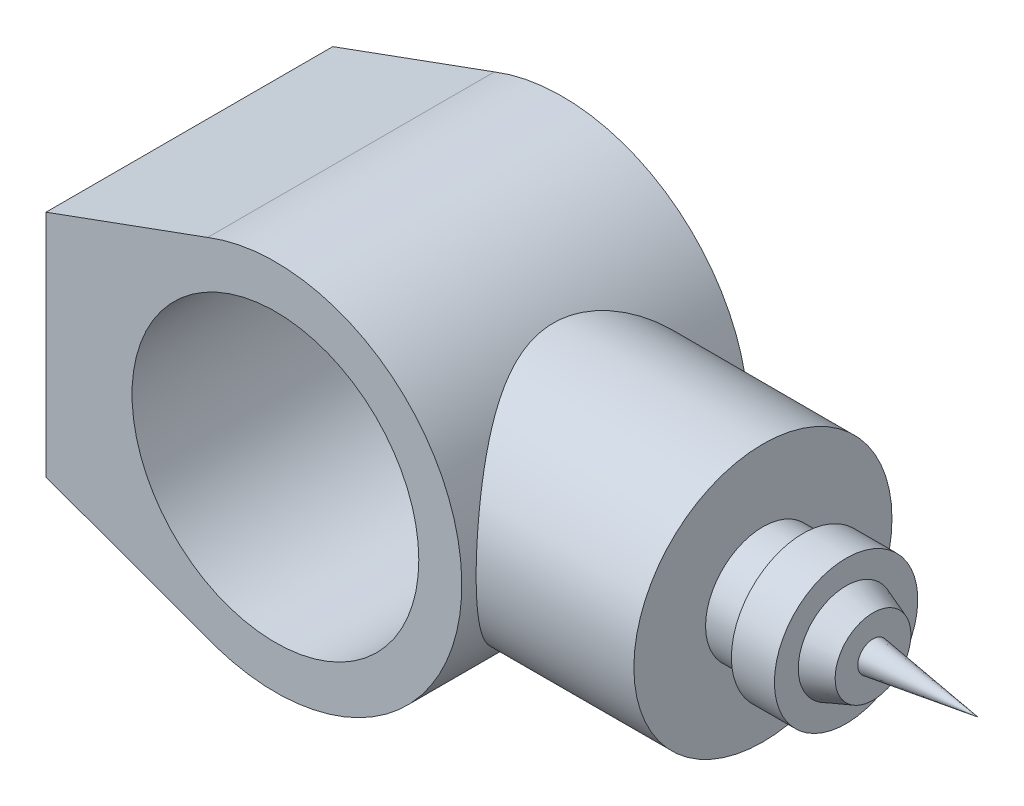
ISO-10303-21;
HEADER;
FILE_DESCRIPTION(('STEP AP214'),'2;1');
FILE_NAME('part.step','',(''),(''),'','','');
FILE_SCHEMA(('AUTOMOTIVE_DESIGN { 1 0 10303 214 1 1 1 1 }'));
ENDSEC;
DATA;
#1=APPLICATION_CONTEXT('core data for automotive mechanical design processes');
#2=APPLICATION_PROTOCOL_DEFINITION('international standard','automotive_design',2000,#1);
#3=PRODUCT_CONTEXT('',#1,'mechanical');
#4=PRODUCT('Part','Part','',(#3));
#5=PRODUCT_RELATED_PRODUCT_CATEGORY('part','',(#4));
#6=PRODUCT_DEFINITION_FORMATION('','',#4);
#7=PRODUCT_DEFINITION_CONTEXT('part definition',#1,'design');
#8=PRODUCT_DEFINITION('design','',#6,#7);
#9=PRODUCT_DEFINITION_SHAPE('','',#8);
#10=(LENGTH_UNIT() NAMED_UNIT(*) SI_UNIT(.MILLI.,.METRE.));
#11=(NAMED_UNIT(*) PLANE_ANGLE_UNIT() SI_UNIT($,.RADIAN.));
#12=(NAMED_UNIT(*) SI_UNIT($,.STERADIAN.) SOLID_ANGLE_UNIT());
#13=UNCERTAINTY_MEASURE_WITH_UNIT(LENGTH_MEASURE(1.E-05),#10,'distance_accuracy_value','');
#14=(GEOMETRIC_REPRESENTATION_CONTEXT(3) GLOBAL_UNCERTAINTY_ASSIGNED_CONTEXT((#13)) GLOBAL_UNIT_ASSIGNED_CONTEXT((#10,
#11,#12)) REPRESENTATION_CONTEXT('',''));
#15=CARTESIAN_POINT('',(0.,0.,0.));
#16=DIRECTION('',(0.,0.,1.));
#17=DIRECTION('',(1.,0.,0.));
#18=AXIS2_PLACEMENT_3D('',#15,#16,#17);
#19=CARTESIAN_POINT('',(0.,0.,50.));
#20=DIRECTION('',(0.,0.,-1.));
#21=DIRECTION('',(-1.,0.,0.));
#22=AXIS2_PLACEMENT_3D('',#19,#20,#21);
#23=CYLINDRICAL_SURFACE('',#22,65.);
#24=CARTESIAN_POINT('',(0.,0.,-50.));
#25=DIRECTION('',(0.,0.,1.));
#26=DIRECTION('',(1.,0.,0.));
#27=AXIS2_PLACEMENT_3D('',#24,#25,#26);
#28=CIRCLE('',#27,65.);
#29=CARTESIAN_POINT('',(-20.4555318195324,-61.6974166232274,-50.));
#30=VERTEX_POINT('',#29);
#31=CARTESIAN_POINT('',(-23.6316122739653,60.5520181441789,-50.));
#32=VERTEX_POINT('',#31);
#33=EDGE_CURVE('E138',#30,#32,#28,.T.);
#34=ORIENTED_EDGE('',*,*,#33,.T.);
#35=DIRECTION('',(0.,0.,-1.));
#36=VECTOR('',#35,1.);
#37=CARTESIAN_POINT('',(-23.6316122739653,60.5520181441789,50.));
#38=LINE('',#37,#36);
#39=CARTESIAN_POINT('',(-23.6316122739653,60.5520181441789,50.));
#40=VERTEX_POINT('',#39);
#41=EDGE_CURVE('E58',#40,#32,#38,.T.);
#42=ORIENTED_EDGE('',*,*,#41,.F.);
#43=CARTESIAN_POINT('',(0.,0.,50.));
#44=DIRECTION('',(0.,0.,1.));
#45=DIRECTION('',(1.,0.,0.));
#46=AXIS2_PLACEMENT_3D('',#43,#44,#45);
#47=CIRCLE('',#46,65.);
#48=CARTESIAN_POINT('',(-20.4555318195324,-61.6974166232274,50.));
#49=VERTEX_POINT('',#48);
#50=EDGE_CURVE('E141',#49,#40,#47,.T.);
#51=ORIENTED_EDGE('',*,*,#50,.F.);
#52=DIRECTION('',(0.,0.,-1.));
#53=VECTOR('',#52,1.);
#54=CARTESIAN_POINT('',(-20.4555318195324,-61.6974166232274,50.));
#55=LINE('',#54,#53);
#56=EDGE_CURVE('E147',#49,#30,#55,.T.);
#57=ORIENTED_EDGE('',*,*,#56,.T.);
#58=EDGE_LOOP('',(#34,#42,#51,#57));
#59=FACE_BOUND('',#58,.T.);
#60=CARTESIAN_POINT('',(65.,0.,-44.9999999999996));
#61=CARTESIAN_POINT('',(65.0000011696057,1.12147330120565,-45.0000012025278));
#62=CARTESIAN_POINT('',(64.9709159765212,2.24292945230778,-44.9580201602478));
#63=CARTESIAN_POINT('',(64.8553068641383,4.47658414079083,-44.7907856093685));
#64=CARTESIAN_POINT('',(64.7687842573088,5.58878288911932,-44.6655340035367));
#65=CARTESIAN_POINT('',(64.5403785763001,7.79555151848629,-44.3336771879687));
#66=CARTESIAN_POINT('',(64.3984760503456,8.89011506447753,-44.1270433931234));
#67=CARTESIAN_POINT('',(64.0626457436966,11.0533096019768,-43.635476013403));
#68=CARTESIAN_POINT('',(63.8687169569864,12.1219400915896,-43.3505409144371));
#69=CARTESIAN_POINT('',(63.4342222744662,14.2212125160506,-42.7078017297041));
#70=CARTESIAN_POINT('',(63.1938918545645,15.2520162370063,-42.3503651251473));
#71=CARTESIAN_POINT('',(62.6709259446924,17.2756280115287,-41.5659763086888));
#72=CARTESIAN_POINT('',(62.3882907364915,18.268436318107,-41.1390245597884));
#73=CARTESIAN_POINT('',(61.786108553932,20.2116697228796,-40.2199419970833));
#74=CARTESIAN_POINT('',(61.4665619062631,21.1620951960855,-39.7278117601439));
#75=CARTESIAN_POINT('',(60.7962171584065,23.0172309124315,-38.6825647509795));
#76=CARTESIAN_POINT('',(60.4454175300334,23.9219389167186,-38.1294449962191));
#77=CARTESIAN_POINT('',(59.6865648974474,25.7601880140228,-36.915173761793));
#78=CARTESIAN_POINT('',(59.2761881540199,26.6893215363404,-36.2488040005486));
#79=CARTESIAN_POINT('',(58.4330275057249,28.4880338622967,-34.852950205922));
#80=CARTESIAN_POINT('',(58.0002425478181,29.357609862654,-34.1234632053604));
#81=CARTESIAN_POINT('',(57.1195111836477,31.0364486388513,-32.6040251352399));
#82=CARTESIAN_POINT('',(56.6715447181891,31.8456267033452,-31.8139921794118));
#83=CARTESIAN_POINT('',(55.7691986061138,33.4006700551815,-30.1773036556988));
#84=CARTESIAN_POINT('',(55.3148185876118,34.146531653429,-29.3306447936716));
#85=CARTESIAN_POINT('',(54.3303114345594,35.6959084068904,-27.4326466159463));
#86=CARTESIAN_POINT('',(53.8005937511269,36.4872853280242,-26.3711450656522));
#87=CARTESIAN_POINT('',(52.7593327891933,37.9773509509911,-24.1760402563895));
#88=CARTESIAN_POINT('',(52.2477941160226,38.6760162868262,-23.0424189272513));
#89=CARTESIAN_POINT('',(51.2608149265043,39.9749077721744,-20.7072341856924));
#90=CARTESIAN_POINT('',(50.7853275075272,40.5752630453964,-19.5057627267962));
#91=CARTESIAN_POINT('',(49.8892399163793,41.6721166930026,-17.0369318640636));
#92=CARTESIAN_POINT('',(49.4686114171658,42.1686687478854,-15.7696069409939));
#93=CARTESIAN_POINT('',(48.8208029416878,42.9149535309565,-13.5723996352812));
#94=CARTESIAN_POINT('',(48.5738420263557,43.1936925213245,-12.6581208440972));
#95=CARTESIAN_POINT('',(48.1238801744123,43.6944569649788,-10.8035389223546));
#96=CARTESIAN_POINT('',(47.9208721021929,43.9164916250901,-9.86324004407378));
#97=CARTESIAN_POINT('',(47.5660754926548,44.3005296261305,-7.96250438663368));
#98=CARTESIAN_POINT('',(47.4142038087044,44.4626304606427,-7.00210302149446));
#99=CARTESIAN_POINT('',(47.1671263845177,44.7246555122386,-5.06554052628477));
#100=CARTESIAN_POINT('',(47.0719206259529,44.824579749433,-4.08937940131184));
#101=CARTESIAN_POINT('',(46.9418899090943,44.9607388198673,-2.12323648479631));
#102=CARTESIAN_POINT('',(46.9073939345417,44.9966266570423,-1.1332085184462));
#103=CARTESIAN_POINT('',(46.9013571135476,45.0029190462422,0.847248377094219));
#104=CARTESIAN_POINT('',(46.9298161498631,44.9733237202183,1.83767730553437));
#105=CARTESIAN_POINT('',(47.0484302849821,44.8492190899201,3.81128752429118));
#106=CARTESIAN_POINT('',(47.13862305521,44.7546701492421,4.79446401850697));
#107=CARTESIAN_POINT('',(47.3768313176079,44.5024241630868,6.74551496467491));
#108=CARTESIAN_POINT('',(47.5248480621437,44.3447257499009,7.71338908473203));
#109=CARTESIAN_POINT('',(47.8621764271841,43.9803320764262,9.56919366964719));
#110=CARTESIAN_POINT('',(48.0484149088864,43.7772163066585,10.4583970625523));
#111=CARTESIAN_POINT('',(48.4609441046406,43.32010640119,12.2144143492185));
#112=CARTESIAN_POINT('',(48.6872496045115,43.0660934784814,13.0812198417586));
#113=CARTESIAN_POINT('',(49.1738509640383,42.5096331932465,14.789822566693));
#114=CARTESIAN_POINT('',(49.4341648638834,42.2071601049958,15.6316062329485));
#115=CARTESIAN_POINT('',(49.9825182796335,41.5563350032134,17.2876417419016));
#116=CARTESIAN_POINT('',(50.2705534011697,41.2079902580444,18.1018979206952));
#117=CARTESIAN_POINT('',(51.0225431471345,40.2767822129268,20.1137766396806));
#118=CARTESIAN_POINT('',(51.5007434523329,39.6654891440572,21.2930273345181));
#119=CARTESIAN_POINT('',(52.4891158781477,38.348029920852,23.5833678403925));
#120=CARTESIAN_POINT('',(52.9993005340589,37.6418264436726,24.6944305853528));
#121=CARTESIAN_POINT('',(54.0361557973494,36.1376496350166,26.8476775780099));
#122=CARTESIAN_POINT('',(54.5628535785461,35.3395185623559,27.8897384505715));
#123=CARTESIAN_POINT('',(55.6171804467178,33.6558443419671,29.8998791095637));
#124=CARTESIAN_POINT('',(56.1448094104418,32.7703120184234,30.8679680307503));
#125=CARTESIAN_POINT('',(57.1932449701135,30.9045304086319,32.7363921475663));
#126=CARTESIAN_POINT('',(57.7139191350983,29.9233731295191,33.6358963165072));
#127=CARTESIAN_POINT('',(58.7296419536465,27.8771206485978,35.3503553497925));
#128=CARTESIAN_POINT('',(59.2246882700661,26.8120178135978,36.1653025097023));
#129=CARTESIAN_POINT('',(60.1756566955639,24.603520952242,37.7024332048818));
#130=CARTESIAN_POINT('',(60.6316475651596,23.4602711709793,38.4247809320637));
#131=CARTESIAN_POINT('',(61.4931891608211,21.0989507187334,39.7703323765774));
#132=CARTESIAN_POINT('',(61.898755017873,19.8809026570888,40.393565850772));
#133=CARTESIAN_POINT('',(62.5646802947783,17.6549035875761,41.40592045654));
#134=CARTESIAN_POINT('',(62.8372982548467,16.6602403417732,41.8163120535014));
#135=CARTESIAN_POINT('',(63.3397164077328,14.6345031625143,42.567566911234));
#136=CARTESIAN_POINT('',(63.5695225359981,13.6034342999589,42.9084398107239));
#137=CARTESIAN_POINT('',(63.9815049902597,11.5110112910015,43.5164676119123));
#138=CARTESIAN_POINT('',(64.1637052650744,10.449672671462,43.7836595836383));
#139=CARTESIAN_POINT('',(64.476639865795,8.30296993183363,44.240986938736));
#140=CARTESIAN_POINT('',(64.6073730982257,7.21760530180246,44.4311206849214));
#141=CARTESIAN_POINT('',(64.8147345736682,5.02649787175016,44.7321113931987));
#142=CARTESIAN_POINT('',(64.8911534961694,3.92069290489756,44.8426616714382));
#143=CARTESIAN_POINT('',(64.9872183357685,1.70145350776203,44.9815637341564));
#144=CARTESIAN_POINT('',(65.0068642771874,0.58801908074765,45.0099155538478));
#145=CARTESIAN_POINT('',(64.9889001241945,-1.63741781931569,44.9839662509353));
#146=CARTESIAN_POINT('',(64.9512898349751,-2.74942028747969,44.9296648471134));
#147=CARTESIAN_POINT('',(64.819734418053,-4.96298947367604,44.7392747901956));
#148=CARTESIAN_POINT('',(64.7257910494465,-6.06455651648128,44.6031886909658));
#149=CARTESIAN_POINT('',(64.491175703309,-8.1825444921215,44.2620157992038));
#150=CARTESIAN_POINT('',(64.3536808680178,-9.20007959997775,44.0616107864458));
#151=CARTESIAN_POINT('',(64.0337856060907,-11.2121337136589,43.5930613516684));
#152=CARTESIAN_POINT('',(63.8513873855499,-12.2066538475799,43.3249202574933));
#153=CARTESIAN_POINT('',(63.4451725249075,-14.1673074608523,42.723985401161));
#154=CARTESIAN_POINT('',(63.2213525684632,-15.1334386601222,42.3911864622052));
#155=CARTESIAN_POINT('',(62.736336352677,-17.0327019487273,41.6643868113873));
#156=CARTESIAN_POINT('',(62.4751380044848,-17.965832190203,41.2703826790347));
#157=CARTESIAN_POINT('',(61.8990085085122,-19.8637431772395,40.3931275129012));
#158=CARTESIAN_POINT('',(61.5815209528501,-20.8256806929253,39.9054081529018));
#159=CARTESIAN_POINT('',(60.9142086391395,-22.7035764997345,38.8677076181215));
#160=CARTESIAN_POINT('',(60.5643826081083,-23.6195329786528,38.3177239921573));
#161=CARTESIAN_POINT('',(59.8381347129401,-25.4032558353403,37.1592008079422));
#162=CARTESIAN_POINT('',(59.4616987975441,-26.270996314329,36.5506302507536));
#163=CARTESIAN_POINT('',(58.6884577670336,-27.9557544991495,35.2787474176629));
#164=CARTESIAN_POINT('',(58.2916515549571,-28.7727694681137,34.6154321925314));
#165=CARTESIAN_POINT('',(57.4151711853793,-30.4889708749911,33.1199200847166));
#166=CARTESIAN_POINT('',(56.9328754552547,-31.3785212006928,32.2781812569552));
#167=CARTESIAN_POINT('',(55.9590893109094,-33.0839042215169,30.5278352445594));
#168=CARTESIAN_POINT('',(55.467597542125,-33.8997259516807,29.6192181500904));
#169=CARTESIAN_POINT('',(54.4860350387397,-35.4558699474099,27.7375714933997));
#170=CARTESIAN_POINT('',(53.9959654596118,-36.1961418986443,26.7644997080011));
#171=CARTESIAN_POINT('',(53.0294834997435,-37.5978502361011,24.7568233036386));
#172=CARTESIAN_POINT('',(52.553069328415,-38.2592969946585,23.7222268074153));
#173=CARTESIAN_POINT('',(51.6799413477261,-39.4291013564638,21.7149007388751));
#174=CARTESIAN_POINT('',(51.2803372484816,-39.9463152685162,20.7485884228098));
#175=CARTESIAN_POINT('',(50.5123974548912,-40.9130636661729,18.770531485189));
#176=CARTESIAN_POINT('',(50.1440619804653,-41.3625976757847,17.7587865441708));
#177=CARTESIAN_POINT('',(49.4504928922364,-42.1893301292689,15.6937972650634));
#178=CARTESIAN_POINT('',(49.1251906412473,-42.566644202947,14.6406225749506));
#179=CARTESIAN_POINT('',(48.5290098021012,-43.2451098617227,12.4950157035292));
#180=CARTESIAN_POINT('',(48.2581179989952,-43.5462799449171,11.4025931307281));
#181=CARTESIAN_POINT('',(47.8271610412375,-44.018687486118,9.39216299943547));
#182=CARTESIAN_POINT('',(47.6558419905218,-44.2036946073207,8.47979353570456));
#183=CARTESIAN_POINT('',(47.3627606953031,-44.517583244497,6.63757582668282));
#184=CARTESIAN_POINT('',(47.2409923142224,-44.6464717105955,5.70772976070411));
#185=CARTESIAN_POINT('',(47.05166615705,-44.8459556683364,3.8371873581701));
#186=CARTESIAN_POINT('',(46.9840561376509,-44.9166073394187,2.89650236820552));
#187=CARTESIAN_POINT('',(46.9055698265682,-44.9985645522097,1.01014116515072));
#188=CARTESIAN_POINT('',(46.8946943314281,-45.0098692606967,0.0644648821701512));
#189=CARTESIAN_POINT('',(46.9301408777119,-44.972908524549,-1.82506201386769));
#190=CARTESIAN_POINT('',(46.9764888551696,-44.9246160680299,-2.76891160474167));
#191=CARTESIAN_POINT('',(47.1245232303033,-44.7693052695385,-4.64731891289829));
#192=CARTESIAN_POINT('',(47.226209296244,-44.6622872796082,-5.58187668584841));
#193=CARTESIAN_POINT('',(47.4811423262629,-44.3911660407895,-7.43666598606527));
#194=CARTESIAN_POINT('',(47.634452919394,-44.2269923369625,-8.35687836049645));
#195=CARTESIAN_POINT('',(47.9871889035597,-43.8440109221367,-10.1768310643419));
#196=CARTESIAN_POINT('',(48.1866204648689,-43.6251959006593,-11.0765686368369));
#197=CARTESIAN_POINT('',(48.6908782922366,-43.0625185245671,-13.1167261780626));
#198=CARTESIAN_POINT('',(49.0093972350599,-42.7008255731353,-14.2488681052179));
#199=CARTESIAN_POINT('',(49.699554494161,-41.8955268796886,-16.466879522637));
#200=CARTESIAN_POINT('',(50.0712093704162,-41.4518955887103,-17.5527344499458));
#201=CARTESIAN_POINT('',(50.8544123719762,-40.4872212981013,-19.6760329984315));
#202=CARTESIAN_POINT('',(51.2660067549033,-39.9660881554129,-20.7134183727634));
#203=CARTESIAN_POINT('',(52.116211879306,-38.8508952329155,-22.7363587217861));
#204=CARTESIAN_POINT('',(52.5548209260535,-38.2568400254561,-23.7219169406068));
#205=CARTESIAN_POINT('',(53.4579357785502,-36.9847423381263,-25.6613286822629));
#206=CARTESIAN_POINT('',(53.9228021101371,-36.3051118639051,-26.6139712103073));
#207=CARTESIAN_POINT('',(54.8583333343946,-34.8753950985048,-28.4617532840727));
#208=CARTESIAN_POINT('',(55.3289982185488,-34.1253089107936,-29.3568929142364));
#209=CARTESIAN_POINT('',(56.2664339133502,-32.5564691651912,-31.0876310121462));
#210=CARTESIAN_POINT('',(56.7332035093429,-31.7376950080829,-31.9232114784016));
#211=CARTESIAN_POINT('',(57.6535165855435,-30.033481652025,-33.5315189390531));
#212=CARTESIAN_POINT('',(58.1070588196761,-29.1480362003112,-34.3042400240117));
#213=CARTESIAN_POINT('',(59.0635284336244,-27.1643113596245,-35.9022819462662));
#214=CARTESIAN_POINT('',(59.5626106290918,-26.054747286961,-36.7159606163352));
#215=CARTESIAN_POINT('',(60.5176757229357,-23.7521280348398,-38.2458641369286));
#216=CARTESIAN_POINT('',(60.9736519283073,-22.5590599397198,-38.9620738611545));
#217=CARTESIAN_POINT('',(61.6149926579414,-20.7127348127312,-39.9558623322093));
#218=CARTESIAN_POINT('',(61.8215919655178,-20.088110583999,-40.2735888165193));
#219=CARTESIAN_POINT('',(62.2191547005856,-18.8206694867556,-40.8812436548854));
#220=CARTESIAN_POINT('',(62.4101203779565,-18.1778552539998,-41.171176009903));
#221=CARTESIAN_POINT('',(62.7748527233683,-16.8752831176651,-41.7219931318352));
#222=CARTESIAN_POINT('',(62.9486230408552,-16.2155288469422,-41.9828840638119));
#223=CARTESIAN_POINT('',(63.2775356475736,-14.8804011558235,-42.4744610119278));
#224=CARTESIAN_POINT('',(63.432679284421,-14.2050288695918,-42.7051492133041));
#225=CARTESIAN_POINT('',(63.80707219681,-12.4447010544916,-43.2597449448096));
#226=CARTESIAN_POINT('',(64.0114184468014,-11.3490405228655,-43.5602757498281));
#227=CARTESIAN_POINT('',(64.3654191982087,-9.12991345978812,-44.0788276443956));
#228=CARTESIAN_POINT('',(64.5150820049425,-8.00645117856265,-44.2968612637906));
#229=CARTESIAN_POINT('',(64.7559993187061,-5.74082253729118,-44.6470112993711));
#230=CARTESIAN_POINT('',(64.847297757104,-4.59867091062178,-44.7791923387438));
#231=CARTESIAN_POINT('',(64.9692976296881,-2.30434018473199,-44.955686263823));
#232=CARTESIAN_POINT('',(64.9999987983895,-1.15216104160191,-44.9999987645655));
#233=CARTESIAN_POINT('',(65.,0.,-44.9999999999996));
#234=B_SPLINE_CURVE_WITH_KNOTS('',3,(#60,#61,#62,#63,#64,#65,#66,#67,#68,#69,#70,#71,#72,#73,
#74,#75,#76,#77,#78,#79,#80,#81,#82,#83,#84,#85,#86,#87,#88,#89,#90,#91,#92,#93,#94,#95,#96,#97,
#98,#99,#100,#101,#102,#103,#104,#105,#106,#107,#108,#109,#110,#111,#112,#113,#114,#115,#116,
#117,#118,#119,#120,#121,#122,#123,#124,#125,#126,#127,#128,#129,#130,#131,#132,#133,#134,#135,
#136,#137,#138,#139,#140,#141,#142,#143,#144,#145,#146,#147,#148,#149,#150,#151,#152,#153,#154,
#155,#156,#157,#158,#159,#160,#161,#162,#163,#164,#165,#166,#167,#168,#169,#170,#171,#172,#173,
#174,#175,#176,#177,#178,#179,#180,#181,#182,#183,#184,#185,#186,#187,#188,#189,#190,#191,#192,
#193,#194,#195,#196,#197,#198,#199,#200,#201,#202,#203,#204,#205,#206,#207,#208,#209,#210,#211,
#212,#213,#214,#215,#216,#217,#218,#219,#220,#221,#222,#223,#224,#225,#226,#227,#228,#229,#230,
#231,#232,#233),.UNSPECIFIED.,.T.,.F.,(4,2,2,2,2,2,2,2,2,2,2,2,2,2,2,2,2,2,2,2,2,2,2,2,2,2,2,2,
2,2,2,2,2,2,2,2,2,2,2,2,2,2,2,2,2,2,2,2,2,2,2,2,2,2,2,2,2,2,2,2,2,2,2,2,2,2,2,2,2,2,2,2,2,2,2,2,
2,2,2,2,2,2,2,2,2,2,4),(0.,3.36323892794144,6.72640100710138,10.0907454360665,13.4551549250109,
16.8029195613731,20.1506619010729,23.4983746134035,26.8462511096753,30.4871649037347,
34.1282499524346,37.7743494260164,41.4206611917409,45.6939383064405,49.9682903731881,
54.2369825353393,58.5034617073672,61.4625138492405,64.4210852373372,67.3748225577202,
70.3285589227263,73.2982527376573,76.2679410220407,79.2394430998938,82.2110095388411,
85.0011411726389,87.7923045951578,90.584954683776,93.3771628083064,97.6064034875675,
101.837312178738,106.075592113262,110.313347816192,114.596218662803,118.879479402292,
123.155037051936,127.429308626694,130.755998382163,134.082226580387,137.406778235214,
140.731400520075,144.068767009318,147.406132068879,150.743508483461,154.080780688208,
157.215791533369,160.350648386749,163.485756334407,166.621039552604,169.990545063149,
173.360183268584,176.73161428665,180.103227050672,184.047902440152,187.993163521895,
191.94103513809,195.888386692538,199.385185586645,202.88200907258,206.373186157812,
209.863514294627,212.700365177753,215.536864625513,218.370624567028,221.204424293963,
224.039508887241,226.874576485218,229.713151272815,232.55210603787,236.23803941247,
239.925124033802,243.616531168718,247.307706963636,251.081871120678,254.856029735252,
258.631324277359,262.406973327354,266.792058434818,271.177823293658,273.368885604935,
275.55963203795,277.749912517597,279.940034437727,283.398420446896,286.856280978073,
290.31153567335,293.766805506531),.UNSPECIFIED.);
#235=CARTESIAN_POINT('',(65.,0.,-44.9999999999996));
#236=VERTEX_POINT('',#235);
#237=EDGE_CURVE('E11',#236,#236,#234,.T.);
#238=ORIENTED_EDGE('',*,*,#237,.F.);
#239=EDGE_LOOP('',(#238));
#240=FACE_BOUND('',#239,.T.);
#241=ADVANCED_FACE('F45',(#59,#240),#23,.T.);
#242=CARTESIAN_POINT('',(0.,0.,50.));
#243=DIRECTION('',(0.,0.,1.));
#244=DIRECTION('',(1.,0.,0.));
#245=AXIS2_PLACEMENT_3D('',#242,#243,#244);
#246=PLANE('',#245);
#247=ORIENTED_EDGE('',*,*,#50,.T.);
#248=DIRECTION('',(-0.93950175991533,-0.342544074705721,0.));
#249=VECTOR('',#248,1.);
#250=CARTESIAN_POINT('',(-80.,40.,50.));
#251=LINE('',#250,#249);
#252=CARTESIAN_POINT('',(-80.,40.,50.));
#253=VERTEX_POINT('',#252);
#254=EDGE_CURVE('E98',#40,#253,#251,.T.);
#255=ORIENTED_EDGE('',*,*,#254,.T.);
#256=DIRECTION('',(0.,-1.,0.));
#257=VECTOR('',#256,1.);
#258=CARTESIAN_POINT('',(-80.,-40.,50.));
#259=LINE('',#258,#257);
#260=CARTESIAN_POINT('',(-80.,-40.,50.));
#261=VERTEX_POINT('',#260);
#262=EDGE_CURVE('E144',#253,#261,#259,.T.);
#263=ORIENTED_EDGE('',*,*,#262,.T.);
#264=DIRECTION('',(0.939565759417996,-0.342368491145557,0.));
#265=VECTOR('',#264,1.);
#266=CARTESIAN_POINT('',(-80.,-40.,50.));
#267=LINE('',#266,#265);
#268=EDGE_CURVE('E66',#261,#49,#267,.T.);
#269=ORIENTED_EDGE('',*,*,#268,.T.);
#270=EDGE_LOOP('',(#247,#255,#263,#269));
#271=FACE_BOUND('',#270,.T.);
#272=CARTESIAN_POINT('',(0.,0.,50.));
#273=DIRECTION('',(0.,0.,1.));
#274=DIRECTION('',(1.,0.,0.));
#275=AXIS2_PLACEMENT_3D('',#272,#273,#274);
#276=CIRCLE('',#275,50.);
#277=CARTESIAN_POINT('',(50.,0.,50.));
#278=VERTEX_POINT('',#277);
#279=EDGE_CURVE('E135',#278,#278,#276,.T.);
#280=ORIENTED_EDGE('',*,*,#279,.F.);
#281=EDGE_LOOP('',(#280));
#282=FACE_BOUND('',#281,.T.);
#283=ADVANCED_FACE('F168',(#271,#282),#246,.T.);
#284=CARTESIAN_POINT('',(0.,0.,-50.));
#285=DIRECTION('',(0.,0.,1.));
#286=DIRECTION('',(1.,0.,0.));
#287=AXIS2_PLACEMENT_3D('',#284,#285,#286);
#288=PLANE('',#287);
#289=ORIENTED_EDGE('',*,*,#33,.F.);
#290=DIRECTION('',(0.939565759417996,-0.342368491145557,0.));
#291=VECTOR('',#290,1.);
#292=CARTESIAN_POINT('',(-80.,-40.,-50.));
#293=LINE('',#292,#291);
#294=CARTESIAN_POINT('',(-80.,-40.,-50.));
#295=VERTEX_POINT('',#294);
#296=EDGE_CURVE('E90',#295,#30,#293,.T.);
#297=ORIENTED_EDGE('',*,*,#296,.F.);
#298=DIRECTION('',(0.,-1.,0.));
#299=VECTOR('',#298,1.);
#300=CARTESIAN_POINT('',(-80.,-40.,-50.));
#301=LINE('',#300,#299);
#302=CARTESIAN_POINT('',(-80.,40.,-50.));
#303=VERTEX_POINT('',#302);
#304=EDGE_CURVE('E84',#303,#295,#301,.T.);
#305=ORIENTED_EDGE('',*,*,#304,.F.);
#306=DIRECTION('',(-0.93950175991533,-0.342544074705721,0.));
#307=VECTOR('',#306,1.);
#308=CARTESIAN_POINT('',(-80.,40.,-50.));
#309=LINE('',#308,#307);
#310=EDGE_CURVE('E150',#32,#303,#309,.T.);
#311=ORIENTED_EDGE('',*,*,#310,.F.);
#312=EDGE_LOOP('',(#289,#297,#305,#311));
#313=FACE_BOUND('',#312,.T.);
#314=CARTESIAN_POINT('',(0.,0.,-50.));
#315=DIRECTION('',(0.,0.,1.));
#316=DIRECTION('',(1.,0.,0.));
#317=AXIS2_PLACEMENT_3D('',#314,#315,#316);
#318=CIRCLE('',#317,50.);
#319=CARTESIAN_POINT('',(50.,0.,-50.));
#320=VERTEX_POINT('',#319);
#321=EDGE_CURVE('E134',#320,#320,#318,.T.);
#322=ORIENTED_EDGE('',*,*,#321,.T.);
#323=EDGE_LOOP('',(#322));
#324=FACE_BOUND('',#323,.T.);
#325=ADVANCED_FACE('F165',(#313,#324),#288,.F.);
#326=CARTESIAN_POINT('',(-80.,40.,50.));
#327=DIRECTION('',(0.342544074705721,-0.939501759915329,0.));
#328=DIRECTION('',(0.939501759915329,0.342544074705721,0.));
#329=AXIS2_PLACEMENT_3D('',#326,#327,#328);
#330=PLANE('',#329);
#331=ORIENTED_EDGE('',*,*,#310,.T.);
#332=DIRECTION('',(0.,0.,-1.));
#333=VECTOR('',#332,1.);
#334=CARTESIAN_POINT('',(-80.,40.,50.));
#335=LINE('',#334,#333);
#336=EDGE_CURVE('E157',#253,#303,#335,.T.);
#337=ORIENTED_EDGE('',*,*,#336,.F.);
#338=ORIENTED_EDGE('',*,*,#254,.F.);
#339=ORIENTED_EDGE('',*,*,#41,.T.);
#340=EDGE_LOOP('',(#331,#337,#338,#339));
#341=FACE_BOUND('',#340,.T.);
#342=ADVANCED_FACE('F159',(#341),#330,.F.);
#343=CARTESIAN_POINT('',(-80.,-40.,50.));
#344=DIRECTION('',(1.,0.,0.));
#345=DIRECTION('',(0.,0.,-1.));
#346=AXIS2_PLACEMENT_3D('',#343,#344,#345);
#347=PLANE('',#346);
#348=ORIENTED_EDGE('',*,*,#304,.T.);
#349=DIRECTION('',(0.,0.,-1.));
#350=VECTOR('',#349,1.);
#351=CARTESIAN_POINT('',(-80.,-40.,50.));
#352=LINE('',#351,#350);
#353=EDGE_CURVE('E155',#261,#295,#352,.T.);
#354=ORIENTED_EDGE('',*,*,#353,.F.);
#355=ORIENTED_EDGE('',*,*,#262,.F.);
#356=ORIENTED_EDGE('',*,*,#336,.T.);
#357=EDGE_LOOP('',(#348,#354,#355,#356));
#358=FACE_BOUND('',#357,.T.);
#359=ADVANCED_FACE('F186',(#358),#347,.F.);
#360=CARTESIAN_POINT('',(-80.,-40.,50.));
#361=DIRECTION('',(0.342368491145557,0.939565759417996,0.));
#362=DIRECTION('',(-0.939565759417996,0.342368491145557,0.));
#363=AXIS2_PLACEMENT_3D('',#360,#361,#362);
#364=PLANE('',#363);
#365=ORIENTED_EDGE('',*,*,#296,.T.);
#366=ORIENTED_EDGE('',*,*,#56,.F.);
#367=ORIENTED_EDGE('',*,*,#268,.F.);
#368=ORIENTED_EDGE('',*,*,#353,.T.);
#369=EDGE_LOOP('',(#365,#366,#367,#368));
#370=FACE_BOUND('',#369,.T.);
#371=ADVANCED_FACE('F175',(#370),#364,.F.);
#372=CARTESIAN_POINT('',(0.,0.,50.));
#373=DIRECTION('',(0.,0.,-1.));
#374=DIRECTION('',(-1.,0.,0.));
#375=AXIS2_PLACEMENT_3D('',#372,#373,#374);
#376=CYLINDRICAL_SURFACE('',#375,50.);
#377=ORIENTED_EDGE('',*,*,#279,.T.);
#378=EDGE_LOOP('',(#377));
#379=FACE_BOUND('',#378,.T.);
#380=ORIENTED_EDGE('',*,*,#321,.F.);
#381=EDGE_LOOP('',(#380));
#382=FACE_BOUND('',#381,.T.);
#383=ADVANCED_FACE('F172',(#379,#382),#376,.F.);
#384=CARTESIAN_POINT('',(120.,0.,8.37955521322352E-13));
#385=DIRECTION('',(-1.,0.,0.));
#386=DIRECTION('',(0.,0.,1.));
#387=AXIS2_PLACEMENT_3D('',#384,#385,#386);
#388=PLANE('',#387);
#389=CARTESIAN_POINT('',(120.,0.,0.));
#390=DIRECTION('',(-1.,0.,0.));
#391=DIRECTION('',(0.,0.,1.));
#392=AXIS2_PLACEMENT_3D('',#389,#390,#391);
#393=CIRCLE('',#392,20.);
#394=CARTESIAN_POINT('',(120.,0.,20.));
#395=VERTEX_POINT('',#394);
#396=EDGE_CURVE('E128',#395,#395,#393,.T.);
#397=ORIENTED_EDGE('',*,*,#396,.T.);
#398=EDGE_LOOP('',(#397));
#399=FACE_BOUND('',#398,.T.);
#400=CARTESIAN_POINT('',(120.,0.,8.37955521322352E-13));
#401=DIRECTION('',(-1.,0.,0.));
#402=DIRECTION('',(0.,0.,1.));
#403=AXIS2_PLACEMENT_3D('',#400,#401,#402);
#404=CIRCLE('',#403,45.);
#405=CARTESIAN_POINT('',(120.,0.,45.0000000000008));
#406=VERTEX_POINT('',#405);
#407=EDGE_CURVE('E131',#406,#406,#404,.T.);
#408=ORIENTED_EDGE('',*,*,#407,.F.);
#409=EDGE_LOOP('',(#408));
#410=FACE_BOUND('',#409,.T.);
#411=ADVANCED_FACE('F174',(#399,#410),#388,.F.);
#412=CARTESIAN_POINT('',(-80.0019999999997,0.,-5.58650980140254E-13));
#413=DIRECTION('',(1.,0.,0.));
#414=DIRECTION('',(0.,0.,-1.));
#415=AXIS2_PLACEMENT_3D('',#412,#413,#414);
#416=CYLINDRICAL_SURFACE('',#415,45.);
#417=ORIENTED_EDGE('',*,*,#407,.T.);
#418=EDGE_LOOP('',(#417));
#419=FACE_BOUND('',#418,.T.);
#420=ORIENTED_EDGE('',*,*,#237,.T.);
#421=EDGE_LOOP('',(#420));
#422=FACE_BOUND('',#421,.T.);
#423=ADVANCED_FACE('F183',(#419,#422),#416,.T.);
#424=CARTESIAN_POINT('',(120.,0.,0.));
#425=DIRECTION('',(-1.,0.,0.));
#426=DIRECTION('',(0.,0.,1.));
#427=AXIS2_PLACEMENT_3D('',#424,#425,#426);
#428=CYLINDRICAL_SURFACE('',#427,20.);
#429=CARTESIAN_POINT('',(134.,0.,0.));
#430=DIRECTION('',(-1.,0.,0.));
#431=DIRECTION('',(0.,0.,1.));
#432=AXIS2_PLACEMENT_3D('',#429,#430,#431);
#433=CIRCLE('',#432,20.);
#434=CARTESIAN_POINT('',(134.,0.,20.));
#435=VERTEX_POINT('',#434);
#436=EDGE_CURVE('E125',#435,#435,#433,.T.);
#437=ORIENTED_EDGE('',*,*,#436,.T.);
#438=EDGE_LOOP('',(#437));
#439=FACE_BOUND('',#438,.T.);
#440=ORIENTED_EDGE('',*,*,#396,.F.);
#441=EDGE_LOOP('',(#440));
#442=FACE_BOUND('',#441,.T.);
#443=ADVANCED_FACE('F237',(#439,#442),#428,.T.);
#444=CARTESIAN_POINT('',(134.,-20.,0.));
#445=DIRECTION('',(-1.,0.,0.));
#446=DIRECTION('',(0.,0.,1.));
#447=AXIS2_PLACEMENT_3D('',#444,#445,#446);
#448=PLANE('',#447);
#449=CARTESIAN_POINT('',(134.,0.,0.));
#450=DIRECTION('',(-1.,0.,0.));
#451=DIRECTION('',(0.,0.,1.));
#452=AXIS2_PLACEMENT_3D('',#449,#450,#451);
#453=CIRCLE('',#452,25.);
#454=CARTESIAN_POINT('',(134.,0.,25.));
#455=VERTEX_POINT('',#454);
#456=EDGE_CURVE('E122',#455,#455,#453,.T.);
#457=ORIENTED_EDGE('',*,*,#456,.T.);
#458=EDGE_LOOP('',(#457));
#459=FACE_BOUND('',#458,.T.);
#460=ORIENTED_EDGE('',*,*,#436,.F.);
#461=EDGE_LOOP('',(#460));
#462=FACE_BOUND('',#461,.T.);
#463=ADVANCED_FACE('F245',(#459,#462),#448,.T.);
#464=CARTESIAN_POINT('',(120.,0.,0.));
#465=DIRECTION('',(-1.,0.,0.));
#466=DIRECTION('',(0.,0.,1.));
#467=AXIS2_PLACEMENT_3D('',#464,#465,#466);
#468=CYLINDRICAL_SURFACE('',#467,25.);
#469=CARTESIAN_POINT('',(149.,0.,0.));
#470=DIRECTION('',(-1.,0.,0.));
#471=DIRECTION('',(0.,0.,1.));
#472=AXIS2_PLACEMENT_3D('',#469,#470,#471);
#473=CIRCLE('',#472,25.);
#474=CARTESIAN_POINT('',(149.,0.,25.));
#475=VERTEX_POINT('',#474);
#476=EDGE_CURVE('E119',#475,#475,#473,.T.);
#477=ORIENTED_EDGE('',*,*,#476,.T.);
#478=EDGE_LOOP('',(#477));
#479=FACE_BOUND('',#478,.T.);
#480=ORIENTED_EDGE('',*,*,#456,.F.);
#481=EDGE_LOOP('',(#480));
#482=FACE_BOUND('',#481,.T.);
#483=ADVANCED_FACE('F255',(#479,#482),#468,.T.);
#484=CARTESIAN_POINT('',(149.,-25.,0.));
#485=DIRECTION('',(1.,0.,0.));
#486=DIRECTION('',(0.,0.,-1.));
#487=AXIS2_PLACEMENT_3D('',#484,#485,#486);
#488=PLANE('',#487);
#489=CARTESIAN_POINT('',(149.,0.,0.));
#490=DIRECTION('',(-1.,0.,0.));
#491=DIRECTION('',(0.,0.,1.));
#492=AXIS2_PLACEMENT_3D('',#489,#490,#491);
#493=CIRCLE('',#492,16.6672182448133);
#494=CARTESIAN_POINT('',(149.,0.,16.6672182448133));
#495=VERTEX_POINT('',#494);
#496=EDGE_CURVE('E114',#495,#495,#493,.T.);
#497=ORIENTED_EDGE('',*,*,#496,.T.);
#498=EDGE_LOOP('',(#497));
#499=FACE_BOUND('',#498,.T.);
#500=ORIENTED_EDGE('',*,*,#476,.F.);
#501=EDGE_LOOP('',(#500));
#502=FACE_BOUND('',#501,.T.);
#503=ADVANCED_FACE('F265',(#499,#502),#488,.T.);
#504=CARTESIAN_POINT('',(149.,0.,0.));
#505=DIRECTION('',(-1.,0.,0.));
#506=DIRECTION('',(0.,0.,1.));
#507=AXIS2_PLACEMENT_3D('',#504,#505,#506);
#508=CONICAL_SURFACE('',#507,16.6672182448133,0.353453408515291);
#509=CARTESIAN_POINT('',(158.381829475048,0.,0.));
#510=DIRECTION('',(-1.,0.,0.));
#511=DIRECTION('',(0.,0.,1.));
#512=AXIS2_PLACEMENT_3D('',#509,#510,#511);
#513=CIRCLE('',#512,13.2058203045118);
#514=CARTESIAN_POINT('',(158.381829475048,0.,13.2058203045118));
#515=VERTEX_POINT('',#514);
#516=EDGE_CURVE('E111',#515,#515,#513,.T.);
#517=ORIENTED_EDGE('',*,*,#516,.T.);
#518=EDGE_LOOP('',(#517));
#519=FACE_BOUND('',#518,.T.);
#520=ORIENTED_EDGE('',*,*,#496,.F.);
#521=EDGE_LOOP('',(#520));
#522=FACE_BOUND('',#521,.T.);
#523=ADVANCED_FACE('F275',(#519,#522),#508,.T.);
#524=CARTESIAN_POINT('',(158.381829475048,-13.2058203045118,0.));
#525=DIRECTION('',(1.,0.,0.));
#526=DIRECTION('',(0.,0.,-1.));
#527=AXIS2_PLACEMENT_3D('',#524,#525,#526);
#528=PLANE('',#527);
#529=CARTESIAN_POINT('',(158.381829475048,0.,0.));
#530=DIRECTION('',(-1.,0.,0.));
#531=DIRECTION('',(0.,0.,1.));
#532=AXIS2_PLACEMENT_3D('',#529,#530,#531);
#533=CIRCLE('',#532,5.30184754642448);
#534=CARTESIAN_POINT('',(158.381829475048,0.,5.30184754642448));
#535=VERTEX_POINT('',#534);
#536=EDGE_CURVE('E109',#535,#535,#533,.T.);
#537=ORIENTED_EDGE('',*,*,#536,.T.);
#538=EDGE_LOOP('',(#537));
#539=FACE_BOUND('',#538,.T.);
#540=ORIENTED_EDGE('',*,*,#516,.F.);
#541=EDGE_LOOP('',(#540));
#542=FACE_BOUND('',#541,.T.);
#543=ADVANCED_FACE('F105',(#539,#542),#528,.T.);
#544=CARTESIAN_POINT('',(158.381829475048,0.,0.));
#545=DIRECTION('',(-1.,0.,0.));
#546=DIRECTION('',(0.,0.,1.));
#547=AXIS2_PLACEMENT_3D('',#544,#545,#546);
#548=CONICAL_SURFACE('',#547,5.30184754642448,0.143788135609248);
#549=CARTESIAN_POINT('',(195.,0.,0.));
#550=VERTEX_POINT('',#549);
#551=VERTEX_LOOP('',#550);
#552=FACE_BOUND('',#551,.T.);
#553=ORIENTED_EDGE('',*,*,#536,.F.);
#554=EDGE_LOOP('',(#553));
#555=FACE_BOUND('',#554,.T.);
#556=ADVANCED_FACE('F102',(#552,#555),#548,.T.);
#557=CLOSED_SHELL('',(#241,#283,#325,#342,#359,#371,#383,#411,#423,#443,#463,#483,#503,#523,
#543,#556));
#558=MANIFOLD_SOLID_BREP('B2',#557);
#559=ADVANCED_BREP_SHAPE_REPRESENTATION('',(#18,#558),#14);
#560=SHAPE_DEFINITION_REPRESENTATION(#9,#559);
ENDSEC;
END-ISO-10303-21;
